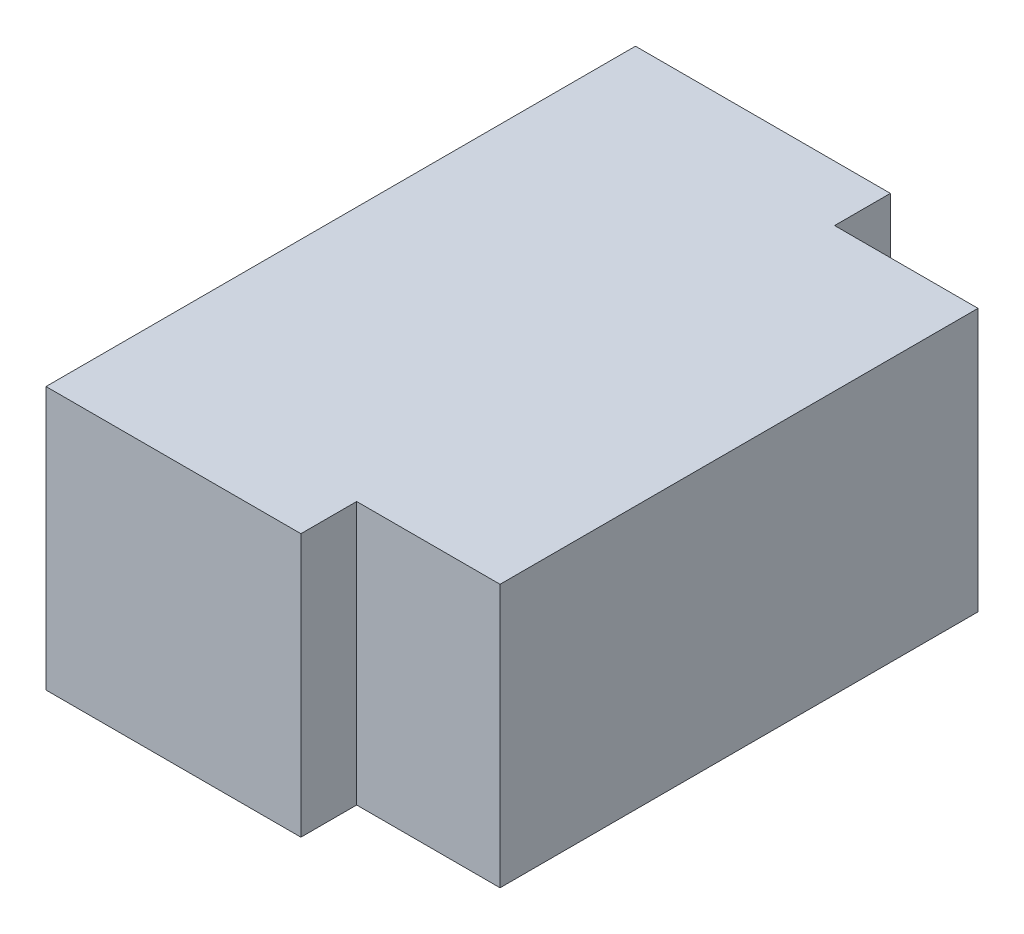
ISO-10303-21;
HEADER;
FILE_DESCRIPTION(('STEP AP214'),'2;1');
FILE_NAME('part.step','',(''),(''),'','','');
FILE_SCHEMA(('AUTOMOTIVE_DESIGN { 1 0 10303 214 1 1 1 1 }'));
ENDSEC;
DATA;
#1=APPLICATION_CONTEXT('core data for automotive mechanical design processes');
#2=APPLICATION_PROTOCOL_DEFINITION('international standard','automotive_design',2000,#1);
#3=PRODUCT_CONTEXT('',#1,'mechanical');
#4=PRODUCT('Part','Part','',(#3));
#5=PRODUCT_RELATED_PRODUCT_CATEGORY('part','',(#4));
#6=PRODUCT_DEFINITION_FORMATION('','',#4);
#7=PRODUCT_DEFINITION_CONTEXT('part definition',#1,'design');
#8=PRODUCT_DEFINITION('design','',#6,#7);
#9=PRODUCT_DEFINITION_SHAPE('','',#8);
#10=(LENGTH_UNIT() NAMED_UNIT(*) SI_UNIT(.MILLI.,.METRE.));
#11=(NAMED_UNIT(*) PLANE_ANGLE_UNIT() SI_UNIT($,.RADIAN.));
#12=(NAMED_UNIT(*) SI_UNIT($,.STERADIAN.) SOLID_ANGLE_UNIT());
#13=UNCERTAINTY_MEASURE_WITH_UNIT(LENGTH_MEASURE(1.E-05),#10,'distance_accuracy_value','');
#14=(GEOMETRIC_REPRESENTATION_CONTEXT(3) GLOBAL_UNCERTAINTY_ASSIGNED_CONTEXT((#13)) GLOBAL_UNIT_ASSIGNED_CONTEXT((#10,
#11,#12)) REPRESENTATION_CONTEXT('',''));
#15=CARTESIAN_POINT('',(0.,0.,0.));
#16=DIRECTION('',(0.,0.,1.));
#17=DIRECTION('',(1.,0.,0.));
#18=AXIS2_PLACEMENT_3D('',#15,#16,#17);
#19=CARTESIAN_POINT('',(-23.6117936117936,33.,-24.2506142506143));
#20=DIRECTION('',(1.,0.,0.));
#21=DIRECTION('',(0.,0.,-1.));
#22=AXIS2_PLACEMENT_3D('',#19,#20,#21);
#23=PLANE('',#22);
#24=DIRECTION('',(0.,0.,1.));
#25=VECTOR('',#24,1.);
#26=CARTESIAN_POINT('',(-23.6117936117936,0.,-24.2506142506143));
#27=LINE('',#26,#25);
#28=CARTESIAN_POINT('',(-23.6117936117936,0.,-31.2506142506143));
#29=VERTEX_POINT('',#28);
#30=CARTESIAN_POINT('',(-23.6117936117936,0.,42.7493857493857));
#31=VERTEX_POINT('',#30);
#32=EDGE_CURVE('E99',#29,#31,#27,.T.);
#33=ORIENTED_EDGE('',*,*,#32,.T.);
#34=DIRECTION('',(0.,-1.,0.));
#35=VECTOR('',#34,1.);
#36=CARTESIAN_POINT('',(-23.6117936117936,33.,42.7493857493857));
#37=LINE('',#36,#35);
#38=CARTESIAN_POINT('',(-23.6117936117936,33.,42.7493857493857));
#39=VERTEX_POINT('',#38);
#40=EDGE_CURVE('E11',#39,#31,#37,.T.);
#41=ORIENTED_EDGE('',*,*,#40,.F.);
#42=DIRECTION('',(0.,0.,-1.));
#43=VECTOR('',#42,1.);
#44=CARTESIAN_POINT('',(-23.6117936117936,33.,-24.2506142506143));
#45=LINE('',#44,#43);
#46=CARTESIAN_POINT('',(-23.6117936117936,33.,-31.2506142506143));
#47=VERTEX_POINT('',#46);
#48=EDGE_CURVE('E65',#39,#47,#45,.T.);
#49=ORIENTED_EDGE('',*,*,#48,.T.);
#50=DIRECTION('',(0.,-1.,0.));
#51=VECTOR('',#50,1.);
#52=CARTESIAN_POINT('',(-23.6117936117936,33.,-31.2506142506143));
#53=LINE('',#52,#51);
#54=EDGE_CURVE('E49',#47,#29,#53,.T.);
#55=ORIENTED_EDGE('',*,*,#54,.T.);
#56=EDGE_LOOP('',(#33,#41,#49,#55));
#57=FACE_BOUND('',#56,.T.);
#58=ADVANCED_FACE('F45',(#57),#23,.F.);
#59=CARTESIAN_POINT('',(-23.6117936117936,33.,42.7493857493857));
#60=DIRECTION('',(0.,0.,-1.));
#61=DIRECTION('',(-1.,0.,0.));
#62=AXIS2_PLACEMENT_3D('',#59,#60,#61);
#63=PLANE('',#62);
#64=DIRECTION('',(1.,0.,0.));
#65=VECTOR('',#64,1.);
#66=CARTESIAN_POINT('',(-23.6117936117936,0.,42.7493857493857));
#67=LINE('',#66,#65);
#68=CARTESIAN_POINT('',(8.38820638820637,0.,42.7493857493857));
#69=VERTEX_POINT('',#68);
#70=EDGE_CURVE('E169',#31,#69,#67,.T.);
#71=ORIENTED_EDGE('',*,*,#70,.T.);
#72=DIRECTION('',(0.,-1.,0.));
#73=VECTOR('',#72,1.);
#74=CARTESIAN_POINT('',(8.38820638820637,33.,42.7493857493857));
#75=LINE('',#74,#73);
#76=CARTESIAN_POINT('',(8.38820638820637,33.,42.7493857493857));
#77=VERTEX_POINT('',#76);
#78=EDGE_CURVE('E56',#77,#69,#75,.T.);
#79=ORIENTED_EDGE('',*,*,#78,.F.);
#80=DIRECTION('',(1.,0.,0.));
#81=VECTOR('',#80,1.);
#82=CARTESIAN_POINT('',(-23.6117936117936,33.,42.7493857493857));
#83=LINE('',#82,#81);
#84=EDGE_CURVE('E141',#39,#77,#83,.T.);
#85=ORIENTED_EDGE('',*,*,#84,.F.);
#86=ORIENTED_EDGE('',*,*,#40,.T.);
#87=EDGE_LOOP('',(#71,#79,#85,#86));
#88=FACE_BOUND('',#87,.T.);
#89=ADVANCED_FACE('F193',(#88),#63,.F.);
#90=CARTESIAN_POINT('',(8.38820638820637,33.,35.7493857493857));
#91=DIRECTION('',(1.,0.,0.));
#92=DIRECTION('',(0.,0.,-1.));
#93=AXIS2_PLACEMENT_3D('',#90,#91,#92);
#94=PLANE('',#93);
#95=DIRECTION('',(0.,0.,1.));
#96=VECTOR('',#95,1.);
#97=CARTESIAN_POINT('',(8.38820638820637,0.,35.7493857493857));
#98=LINE('',#97,#96);
#99=CARTESIAN_POINT('',(8.38820638820637,0.,35.7493857493857));
#100=VERTEX_POINT('',#99);
#101=EDGE_CURVE('E124',#100,#69,#98,.T.);
#102=ORIENTED_EDGE('',*,*,#101,.F.);
#103=DIRECTION('',(0.,-1.,0.));
#104=VECTOR('',#103,1.);
#105=CARTESIAN_POINT('',(8.38820638820637,33.,35.7493857493857));
#106=LINE('',#105,#104);
#107=CARTESIAN_POINT('',(8.38820638820637,33.,35.7493857493857));
#108=VERTEX_POINT('',#107);
#109=EDGE_CURVE('E118',#108,#100,#106,.T.);
#110=ORIENTED_EDGE('',*,*,#109,.F.);
#111=DIRECTION('',(0.,0.,1.));
#112=VECTOR('',#111,1.);
#113=CARTESIAN_POINT('',(8.38820638820637,33.,35.7493857493857));
#114=LINE('',#113,#112);
#115=EDGE_CURVE('E122',#108,#77,#114,.T.);
#116=ORIENTED_EDGE('',*,*,#115,.T.);
#117=ORIENTED_EDGE('',*,*,#78,.T.);
#118=EDGE_LOOP('',(#102,#110,#116,#117));
#119=FACE_BOUND('',#118,.T.);
#120=ADVANCED_FACE('F120',(#119),#94,.T.);
#121=CARTESIAN_POINT('',(8.38820638820637,33.,35.7493857493857));
#122=DIRECTION('',(0.,0.,-1.));
#123=DIRECTION('',(-1.,0.,0.));
#124=AXIS2_PLACEMENT_3D('',#121,#122,#123);
#125=PLANE('',#124);
#126=DIRECTION('',(1.,0.,0.));
#127=VECTOR('',#126,1.);
#128=CARTESIAN_POINT('',(8.38820638820637,0.,35.7493857493857));
#129=LINE('',#128,#127);
#130=CARTESIAN_POINT('',(26.3882063882064,0.,35.7493857493857));
#131=VERTEX_POINT('',#130);
#132=EDGE_CURVE('E164',#100,#131,#129,.T.);
#133=ORIENTED_EDGE('',*,*,#132,.T.);
#134=DIRECTION('',(0.,-1.,0.));
#135=VECTOR('',#134,1.);
#136=CARTESIAN_POINT('',(26.3882063882064,33.,35.7493857493857));
#137=LINE('',#136,#135);
#138=CARTESIAN_POINT('',(26.3882063882064,33.,35.7493857493857));
#139=VERTEX_POINT('',#138);
#140=EDGE_CURVE('E129',#139,#131,#137,.T.);
#141=ORIENTED_EDGE('',*,*,#140,.F.);
#142=DIRECTION('',(1.,0.,0.));
#143=VECTOR('',#142,1.);
#144=CARTESIAN_POINT('',(8.38820638820637,33.,35.7493857493857));
#145=LINE('',#144,#143);
#146=EDGE_CURVE('E132',#108,#139,#145,.T.);
#147=ORIENTED_EDGE('',*,*,#146,.F.);
#148=ORIENTED_EDGE('',*,*,#109,.T.);
#149=EDGE_LOOP('',(#133,#141,#147,#148));
#150=FACE_BOUND('',#149,.T.);
#151=ADVANCED_FACE('F133',(#150),#125,.F.);
#152=CARTESIAN_POINT('',(26.3882063882064,33.,-24.2506142506143));
#153=DIRECTION('',(1.,0.,0.));
#154=DIRECTION('',(0.,0.,-1.));
#155=AXIS2_PLACEMENT_3D('',#152,#153,#154);
#156=PLANE('',#155);
#157=DIRECTION('',(0.,0.,1.));
#158=VECTOR('',#157,1.);
#159=CARTESIAN_POINT('',(26.3882063882064,0.,-24.2506142506143));
#160=LINE('',#159,#158);
#161=CARTESIAN_POINT('',(26.3882063882064,0.,-24.2506142506143));
#162=VERTEX_POINT('',#161);
#163=EDGE_CURVE('E160',#162,#131,#160,.T.);
#164=ORIENTED_EDGE('',*,*,#163,.F.);
#165=DIRECTION('',(0.,-1.,0.));
#166=VECTOR('',#165,1.);
#167=CARTESIAN_POINT('',(26.3882063882064,33.,-24.2506142506143));
#168=LINE('',#167,#166);
#169=CARTESIAN_POINT('',(26.3882063882064,33.,-24.2506142506143));
#170=VERTEX_POINT('',#169);
#171=EDGE_CURVE('E178',#170,#162,#168,.T.);
#172=ORIENTED_EDGE('',*,*,#171,.F.);
#173=DIRECTION('',(0.,0.,1.));
#174=VECTOR('',#173,1.);
#175=CARTESIAN_POINT('',(26.3882063882064,33.,-24.2506142506143));
#176=LINE('',#175,#174);
#177=EDGE_CURVE('E137',#170,#139,#176,.T.);
#178=ORIENTED_EDGE('',*,*,#177,.T.);
#179=ORIENTED_EDGE('',*,*,#140,.T.);
#180=EDGE_LOOP('',(#164,#172,#178,#179));
#181=FACE_BOUND('',#180,.T.);
#182=ADVANCED_FACE('F206',(#181),#156,.T.);
#183=CARTESIAN_POINT('',(8.38820638820636,33.,-24.2506142506143));
#184=DIRECTION('',(0.,0.,-1.));
#185=DIRECTION('',(-1.,0.,0.));
#186=AXIS2_PLACEMENT_3D('',#183,#184,#185);
#187=PLANE('',#186);
#188=DIRECTION('',(1.,0.,0.));
#189=VECTOR('',#188,1.);
#190=CARTESIAN_POINT('',(8.38820638820636,0.,-24.2506142506143));
#191=LINE('',#190,#189);
#192=CARTESIAN_POINT('',(8.38820638820636,0.,-24.2506142506143));
#193=VERTEX_POINT('',#192);
#194=EDGE_CURVE('E156',#193,#162,#191,.T.);
#195=ORIENTED_EDGE('',*,*,#194,.F.);
#196=DIRECTION('',(0.,-1.,0.));
#197=VECTOR('',#196,1.);
#198=CARTESIAN_POINT('',(8.38820638820636,33.,-24.2506142506143));
#199=LINE('',#198,#197);
#200=CARTESIAN_POINT('',(8.38820638820636,33.,-24.2506142506143));
#201=VERTEX_POINT('',#200);
#202=EDGE_CURVE('E181',#201,#193,#199,.T.);
#203=ORIENTED_EDGE('',*,*,#202,.F.);
#204=DIRECTION('',(1.,0.,0.));
#205=VECTOR('',#204,1.);
#206=CARTESIAN_POINT('',(8.38820638820636,33.,-24.2506142506143));
#207=LINE('',#206,#205);
#208=EDGE_CURVE('E223',#201,#170,#207,.T.);
#209=ORIENTED_EDGE('',*,*,#208,.T.);
#210=ORIENTED_EDGE('',*,*,#171,.T.);
#211=EDGE_LOOP('',(#195,#203,#209,#210));
#212=FACE_BOUND('',#211,.T.);
#213=ADVANCED_FACE('F209',(#212),#187,.T.);
#214=CARTESIAN_POINT('',(8.38820638820636,33.,-24.2506142506143));
#215=DIRECTION('',(-1.,0.,0.));
#216=DIRECTION('',(0.,0.,1.));
#217=AXIS2_PLACEMENT_3D('',#214,#215,#216);
#218=PLANE('',#217);
#219=DIRECTION('',(0.,0.,-1.));
#220=VECTOR('',#219,1.);
#221=CARTESIAN_POINT('',(8.38820638820636,0.,-24.2506142506143));
#222=LINE('',#221,#220);
#223=CARTESIAN_POINT('',(8.38820638820636,0.,-31.2506142506143));
#224=VERTEX_POINT('',#223);
#225=EDGE_CURVE('E152',#193,#224,#222,.T.);
#226=ORIENTED_EDGE('',*,*,#225,.T.);
#227=DIRECTION('',(0.,-1.,0.));
#228=VECTOR('',#227,1.);
#229=CARTESIAN_POINT('',(8.38820638820636,33.,-31.2506142506143));
#230=LINE('',#229,#228);
#231=CARTESIAN_POINT('',(8.38820638820636,33.,-31.2506142506143));
#232=VERTEX_POINT('',#231);
#233=EDGE_CURVE('E183',#232,#224,#230,.T.);
#234=ORIENTED_EDGE('',*,*,#233,.F.);
#235=DIRECTION('',(0.,0.,-1.));
#236=VECTOR('',#235,1.);
#237=CARTESIAN_POINT('',(8.38820638820636,33.,-24.2506142506143));
#238=LINE('',#237,#236);
#239=EDGE_CURVE('E220',#201,#232,#238,.T.);
#240=ORIENTED_EDGE('',*,*,#239,.F.);
#241=ORIENTED_EDGE('',*,*,#202,.T.);
#242=EDGE_LOOP('',(#226,#234,#240,#241));
#243=FACE_BOUND('',#242,.T.);
#244=ADVANCED_FACE('F212',(#243),#218,.F.);
#245=CARTESIAN_POINT('',(-23.6117936117936,33.,-31.2506142506143));
#246=DIRECTION('',(0.,0.,-1.));
#247=DIRECTION('',(-1.,0.,0.));
#248=AXIS2_PLACEMENT_3D('',#245,#246,#247);
#249=PLANE('',#248);
#250=DIRECTION('',(1.,0.,0.));
#251=VECTOR('',#250,1.);
#252=CARTESIAN_POINT('',(-23.6117936117936,0.,-31.2506142506143));
#253=LINE('',#252,#251);
#254=EDGE_CURVE('E148',#29,#224,#253,.T.);
#255=ORIENTED_EDGE('',*,*,#254,.F.);
#256=ORIENTED_EDGE('',*,*,#54,.F.);
#257=DIRECTION('',(1.,0.,0.));
#258=VECTOR('',#257,1.);
#259=CARTESIAN_POINT('',(-23.6117936117936,33.,-31.2506142506143));
#260=LINE('',#259,#258);
#261=EDGE_CURVE('E231',#47,#232,#260,.T.);
#262=ORIENTED_EDGE('',*,*,#261,.T.);
#263=ORIENTED_EDGE('',*,*,#233,.T.);
#264=EDGE_LOOP('',(#255,#256,#262,#263));
#265=FACE_BOUND('',#264,.T.);
#266=ADVANCED_FACE('F47',(#265),#249,.T.);
#267=CARTESIAN_POINT('',(0.,33.,0.));
#268=DIRECTION('',(0.,-1.,0.));
#269=DIRECTION('',(0.,0.,-1.));
#270=AXIS2_PLACEMENT_3D('',#267,#268,#269);
#271=PLANE('',#270);
#272=ORIENTED_EDGE('',*,*,#48,.F.);
#273=ORIENTED_EDGE('',*,*,#84,.T.);
#274=ORIENTED_EDGE('',*,*,#115,.F.);
#275=ORIENTED_EDGE('',*,*,#146,.T.);
#276=ORIENTED_EDGE('',*,*,#177,.F.);
#277=ORIENTED_EDGE('',*,*,#208,.F.);
#278=ORIENTED_EDGE('',*,*,#239,.T.);
#279=ORIENTED_EDGE('',*,*,#261,.F.);
#280=EDGE_LOOP('',(#272,#273,#274,#275,#276,#277,#278,#279));
#281=FACE_BOUND('',#280,.T.);
#282=ADVANCED_FACE('F139',(#281),#271,.F.);
#283=CARTESIAN_POINT('',(0.,0.,0.));
#284=DIRECTION('',(0.,-1.,0.));
#285=DIRECTION('',(0.,0.,-1.));
#286=AXIS2_PLACEMENT_3D('',#283,#284,#285);
#287=PLANE('',#286);
#288=ORIENTED_EDGE('',*,*,#32,.F.);
#289=ORIENTED_EDGE('',*,*,#254,.T.);
#290=ORIENTED_EDGE('',*,*,#225,.F.);
#291=ORIENTED_EDGE('',*,*,#194,.T.);
#292=ORIENTED_EDGE('',*,*,#163,.T.);
#293=ORIENTED_EDGE('',*,*,#132,.F.);
#294=ORIENTED_EDGE('',*,*,#101,.T.);
#295=ORIENTED_EDGE('',*,*,#70,.F.);
#296=EDGE_LOOP('',(#288,#289,#290,#291,#292,#293,#294,#295));
#297=FACE_BOUND('',#296,.T.);
#298=ADVANCED_FACE('F189',(#297),#287,.T.);
#299=CLOSED_SHELL('',(#58,#89,#120,#151,#182,#213,#244,#266,#282,#298));
#300=MANIFOLD_SOLID_BREP('B2',#299);
#301=ADVANCED_BREP_SHAPE_REPRESENTATION('',(#18,#300),#14);
#302=SHAPE_DEFINITION_REPRESENTATION(#9,#301);
ENDSEC;
END-ISO-10303-21;
